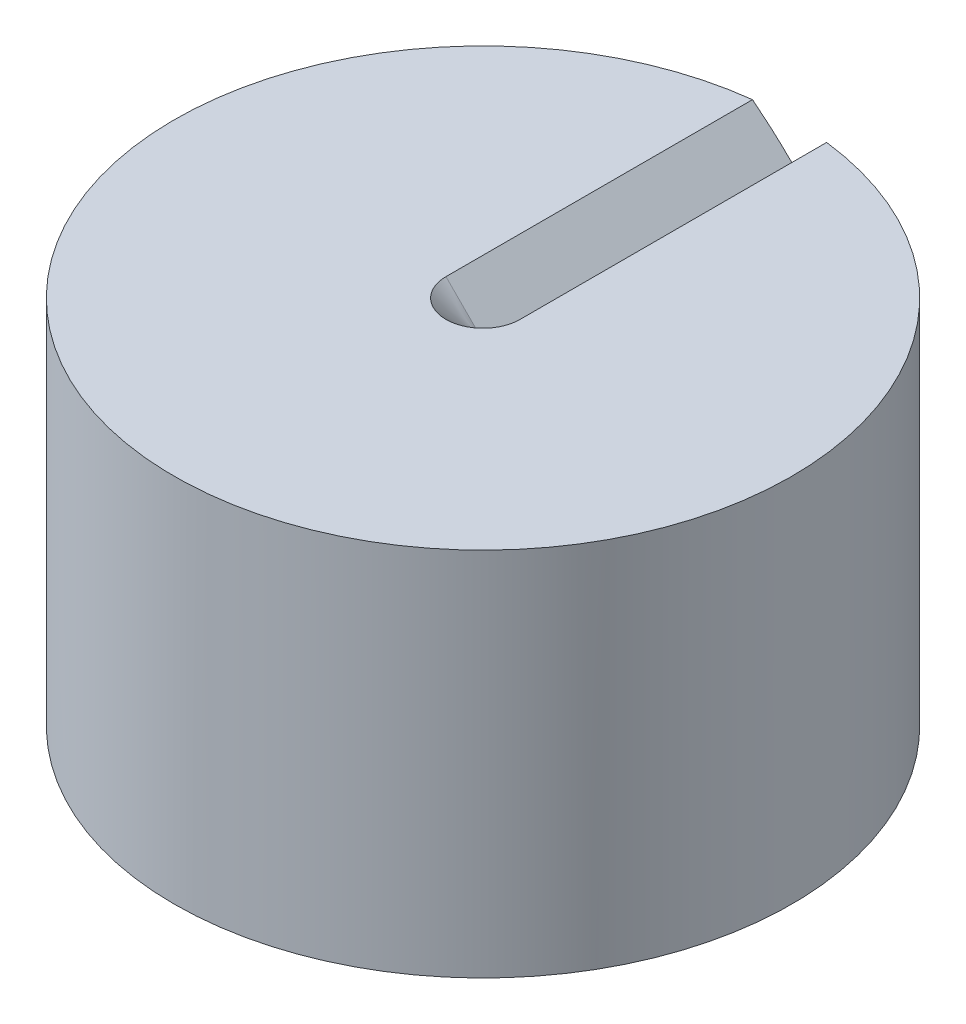
ISO-10303-21;
HEADER;
FILE_DESCRIPTION(('STEP AP214'),'2;1');
FILE_NAME('part.step','',(''),(''),'','','');
FILE_SCHEMA(('AUTOMOTIVE_DESIGN { 1 0 10303 214 1 1 1 1 }'));
ENDSEC;
DATA;
#1=APPLICATION_CONTEXT('core data for automotive mechanical design processes');
#2=APPLICATION_PROTOCOL_DEFINITION('international standard','automotive_design',2000,#1);
#3=PRODUCT_CONTEXT('',#1,'mechanical');
#4=PRODUCT('Part','Part','',(#3));
#5=PRODUCT_RELATED_PRODUCT_CATEGORY('part','',(#4));
#6=PRODUCT_DEFINITION_FORMATION('','',#4);
#7=PRODUCT_DEFINITION_CONTEXT('part definition',#1,'design');
#8=PRODUCT_DEFINITION('design','',#6,#7);
#9=PRODUCT_DEFINITION_SHAPE('','',#8);
#10=(LENGTH_UNIT() NAMED_UNIT(*) SI_UNIT(.MILLI.,.METRE.));
#11=(NAMED_UNIT(*) PLANE_ANGLE_UNIT() SI_UNIT($,.RADIAN.));
#12=(NAMED_UNIT(*) SI_UNIT($,.STERADIAN.) SOLID_ANGLE_UNIT());
#13=UNCERTAINTY_MEASURE_WITH_UNIT(LENGTH_MEASURE(1.E-05),#10,'distance_accuracy_value','');
#14=(GEOMETRIC_REPRESENTATION_CONTEXT(3) GLOBAL_UNCERTAINTY_ASSIGNED_CONTEXT((#13)) GLOBAL_UNIT_ASSIGNED_CONTEXT((#10,
#11,#12)) REPRESENTATION_CONTEXT('',''));
#15=CARTESIAN_POINT('',(0.,0.,0.));
#16=DIRECTION('',(0.,0.,1.));
#17=DIRECTION('',(1.,0.,0.));
#18=AXIS2_PLACEMENT_3D('',#15,#16,#17);
#19=CARTESIAN_POINT('',(0.,67.0173318295596,0.));
#20=DIRECTION('',(0.,-1.,0.));
#21=DIRECTION('',(0.,0.,-1.));
#22=AXIS2_PLACEMENT_3D('',#19,#20,#21);
#23=CYLINDRICAL_SURFACE('',#22,16.51);
#24=CARTESIAN_POINT('',(0.,15.24,0.));
#25=DIRECTION('',(0.,1.,0.));
#26=DIRECTION('',(0.,0.,1.));
#27=AXIS2_PLACEMENT_3D('',#24,#25,#26);
#28=CIRCLE('',#27,16.51);
#29=CARTESIAN_POINT('',(0.,15.24,16.51));
#30=VERTEX_POINT('',#29);
#31=EDGE_CURVE('E80',#30,#30,#28,.F.);
#32=ORIENTED_EDGE('',*,*,#31,.F.);
#33=EDGE_LOOP('',(#32));
#34=FACE_BOUND('',#33,.T.);
#35=CARTESIAN_POINT('',(0.,-2.54,0.));
#36=DIRECTION('',(0.,-1.,0.));
#37=DIRECTION('',(0.,0.,-1.));
#38=AXIS2_PLACEMENT_3D('',#35,#36,#37);
#39=CIRCLE('',#38,16.51);
#40=CARTESIAN_POINT('',(0.,-2.54,-16.51));
#41=VERTEX_POINT('',#40);
#42=EDGE_CURVE('E91',#41,#41,#39,.T.);
#43=ORIENTED_EDGE('',*,*,#42,.T.);
#44=EDGE_LOOP('',(#43));
#45=FACE_BOUND('',#44,.T.);
#46=ADVANCED_FACE('F39',(#34,#45),#23,.F.);
#47=CARTESIAN_POINT('',(0.,67.0173318295596,0.));
#48=DIRECTION('',(0.,-1.,0.));
#49=DIRECTION('',(0.,0.,-1.));
#50=AXIS2_PLACEMENT_3D('',#47,#48,#49);
#51=CYLINDRICAL_SURFACE('',#50,5.0165);
#52=CARTESIAN_POINT('',(0.,13.208,0.));
#53=DIRECTION('',(0.,1.,0.));
#54=DIRECTION('',(0.,0.,1.));
#55=AXIS2_PLACEMENT_3D('',#52,#53,#54);
#56=CIRCLE('',#55,5.0165);
#57=CARTESIAN_POINT('',(0.,13.208,5.0165));
#58=VERTEX_POINT('',#57);
#59=EDGE_CURVE('E102',#58,#58,#56,.F.);
#60=ORIENTED_EDGE('',*,*,#59,.T.);
#61=EDGE_LOOP('',(#60));
#62=FACE_BOUND('',#61,.T.);
#63=CARTESIAN_POINT('',(0.,0.,0.));
#64=DIRECTION('',(0.,-1.,0.));
#65=DIRECTION('',(0.,0.,-1.));
#66=AXIS2_PLACEMENT_3D('',#63,#64,#65);
#67=CIRCLE('',#66,5.0165);
#68=CARTESIAN_POINT('',(0.,0.,-5.0165));
#69=VERTEX_POINT('',#68);
#70=EDGE_CURVE('E110',#69,#69,#67,.T.);
#71=ORIENTED_EDGE('',*,*,#70,.F.);
#72=EDGE_LOOP('',(#71));
#73=FACE_BOUND('',#72,.T.);
#74=ADVANCED_FACE('F135',(#62,#73),#51,.T.);
#75=CARTESIAN_POINT('',(0.,15.24,0.));
#76=DIRECTION('',(0.,1.,0.));
#77=DIRECTION('',(0.,0.,1.));
#78=AXIS2_PLACEMENT_3D('',#75,#76,#77);
#79=PLANE('',#78);
#80=CARTESIAN_POINT('',(0.,15.24,0.));
#81=DIRECTION('',(0.,1.,0.));
#82=DIRECTION('',(0.,0.,1.));
#83=AXIS2_PLACEMENT_3D('',#80,#81,#82);
#84=CIRCLE('',#83,7.0485);
#85=CARTESIAN_POINT('',(0.,15.24,7.0485));
#86=VERTEX_POINT('',#85);
#87=EDGE_CURVE('E99',#86,#86,#84,.T.);
#88=ORIENTED_EDGE('',*,*,#87,.T.);
#89=EDGE_LOOP('',(#88));
#90=FACE_BOUND('',#89,.T.);
#91=ORIENTED_EDGE('',*,*,#31,.T.);
#92=EDGE_LOOP('',(#91));
#93=FACE_BOUND('',#92,.T.);
#94=ADVANCED_FACE('F140',(#90,#93),#79,.F.);
#95=CARTESIAN_POINT('',(0.,6.858,0.));
#96=DIRECTION('',(0.,-1.,0.));
#97=DIRECTION('',(0.,0.,-1.));
#98=AXIS2_PLACEMENT_3D('',#95,#96,#97);
#99=PLANE('',#98);
#100=CARTESIAN_POINT('',(0.,6.858,0.));
#101=DIRECTION('',(0.,-1.,0.));
#102=DIRECTION('',(0.,0.,-1.));
#103=AXIS2_PLACEMENT_3D('',#100,#101,#102);
#104=CIRCLE('',#103,2.9845);
#105=CARTESIAN_POINT('',(0.,6.858,-2.9845));
#106=VERTEX_POINT('',#105);
#107=EDGE_CURVE('E106',#106,#106,#104,.T.);
#108=ORIENTED_EDGE('',*,*,#107,.T.);
#109=EDGE_LOOP('',(#108));
#110=FACE_BOUND('',#109,.T.);
#111=ADVANCED_FACE('F147',(#110),#99,.T.);
#112=CARTESIAN_POINT('',(0.,6.858,0.));
#113=DIRECTION('',(0.,-1.,0.));
#114=DIRECTION('',(0.,0.,-1.));
#115=AXIS2_PLACEMENT_3D('',#112,#113,#114);
#116=CYLINDRICAL_SURFACE('',#115,2.9845);
#117=ORIENTED_EDGE('',*,*,#107,.F.);
#118=EDGE_LOOP('',(#117));
#119=FACE_BOUND('',#118,.T.);
#120=CARTESIAN_POINT('',(0.,0.,0.));
#121=DIRECTION('',(0.,-1.,0.));
#122=DIRECTION('',(0.,0.,-1.));
#123=AXIS2_PLACEMENT_3D('',#120,#121,#122);
#124=CIRCLE('',#123,2.9845);
#125=CARTESIAN_POINT('',(0.,0.,-2.9845));
#126=VERTEX_POINT('',#125);
#127=EDGE_CURVE('E107',#126,#126,#124,.T.);
#128=ORIENTED_EDGE('',*,*,#127,.T.);
#129=EDGE_LOOP('',(#128));
#130=FACE_BOUND('',#129,.T.);
#131=ADVANCED_FACE('F151',(#119,#130),#116,.F.);
#132=CARTESIAN_POINT('',(0.,0.,0.));
#133=DIRECTION('',(0.,1.,0.));
#134=DIRECTION('',(0.,0.,1.));
#135=AXIS2_PLACEMENT_3D('',#132,#133,#134);
#136=PLANE('',#135);
#137=ORIENTED_EDGE('',*,*,#127,.F.);
#138=EDGE_LOOP('',(#137));
#139=FACE_BOUND('',#138,.T.);
#140=ORIENTED_EDGE('',*,*,#70,.T.);
#141=EDGE_LOOP('',(#140));
#142=FACE_BOUND('',#141,.T.);
#143=ADVANCED_FACE('F130',(#139,#142),#136,.F.);
#144=CARTESIAN_POINT('',(0.,13.208,0.));
#145=DIRECTION('',(0.,1.,0.));
#146=DIRECTION('',(0.,0.,1.));
#147=AXIS2_PLACEMENT_3D('',#144,#145,#146);
#148=TOROIDAL_SURFACE('',#147,7.0485,2.032);
#149=ORIENTED_EDGE('',*,*,#87,.F.);
#150=EDGE_LOOP('',(#149));
#151=FACE_BOUND('',#150,.T.);
#152=ORIENTED_EDGE('',*,*,#59,.F.);
#153=EDGE_LOOP('',(#152));
#154=FACE_BOUND('',#153,.T.);
#155=ADVANCED_FACE('F123',(#151,#154),#148,.F.);
#156=CARTESIAN_POINT('',(0.,-2.54,0.));
#157=DIRECTION('',(0.,-1.,0.));
#158=DIRECTION('',(0.,0.,-1.));
#159=AXIS2_PLACEMENT_3D('',#156,#157,#158);
#160=PLANE('',#159);
#161=CARTESIAN_POINT('',(0.,-2.54,0.));
#162=DIRECTION('',(0.,-1.,0.));
#163=DIRECTION('',(0.,0.,-1.));
#164=AXIS2_PLACEMENT_3D('',#161,#162,#163);
#165=CIRCLE('',#164,19.05);
#166=CARTESIAN_POINT('',(0.,-2.54,-19.05));
#167=VERTEX_POINT('',#166);
#168=EDGE_CURVE('E88',#167,#167,#165,.T.);
#169=ORIENTED_EDGE('',*,*,#168,.T.);
#170=EDGE_LOOP('',(#169));
#171=FACE_BOUND('',#170,.T.);
#172=ORIENTED_EDGE('',*,*,#42,.F.);
#173=EDGE_LOOP('',(#172));
#174=FACE_BOUND('',#173,.T.);
#175=ADVANCED_FACE('F121',(#171,#174),#160,.T.);
#176=CARTESIAN_POINT('',(0.,20.574,0.));
#177=DIRECTION('',(0.,1.,0.));
#178=DIRECTION('',(0.,0.,1.));
#179=AXIS2_PLACEMENT_3D('',#176,#177,#178);
#180=CONICAL_SURFACE('',#179,2.54000000000004,0.785398163397454);
#181=DIRECTION('',(0.707106781186551,-0.707106781186544,0.));
#182=VECTOR('',#181,1.);
#183=CARTESIAN_POINT('',(-2.54,20.574,0.));
#184=LINE('',#183,#182);
#185=CARTESIAN_POINT('',(-2.28599999999998,20.32,0.));
#186=VERTEX_POINT('',#185);
#187=CARTESIAN_POINT('',(0.,18.034,0.));
#188=VERTEX_POINT('',#187);
#189=EDGE_CURVE('E43',#186,#188,#184,.T.);
#190=ORIENTED_EDGE('',*,*,#189,.F.);
#191=CARTESIAN_POINT('',(0.,20.32,0.));
#192=DIRECTION('',(0.,1.,0.));
#193=DIRECTION('',(0.,0.,1.));
#194=AXIS2_PLACEMENT_3D('',#191,#192,#193);
#195=CIRCLE('',#194,2.28600000000002);
#196=CARTESIAN_POINT('',(2.28599999999998,20.32,0.));
#197=VERTEX_POINT('',#196);
#198=EDGE_CURVE('E83',#197,#186,#195,.F.);
#199=ORIENTED_EDGE('',*,*,#198,.F.);
#200=DIRECTION('',(0.707106781186551,0.707106781186544,0.));
#201=VECTOR('',#200,1.);
#202=CARTESIAN_POINT('',(0.,18.034,0.));
#203=LINE('',#202,#201);
#204=EDGE_CURVE('E81',#188,#197,#203,.T.);
#205=ORIENTED_EDGE('',*,*,#204,.F.);
#206=EDGE_LOOP('',(#190,#199,#205));
#207=FACE_BOUND('',#206,.T.);
#208=ADVANCED_FACE('F41',(#207),#180,.F.);
#209=CARTESIAN_POINT('',(0.,18.034,0.));
#210=DIRECTION('',(0.707106781186544,-0.707106781186551,0.));
#211=DIRECTION('',(0.,0.,-1.));
#212=AXIS2_PLACEMENT_3D('',#209,#210,#211);
#213=PLANE('',#212);
#214=DIRECTION('',(0.,0.,1.));
#215=VECTOR('',#214,1.);
#216=CARTESIAN_POINT('',(0.,18.034,0.));
#217=LINE('',#216,#215);
#218=CARTESIAN_POINT('',(0.,18.034,-19.05));
#219=VERTEX_POINT('',#218);
#220=EDGE_CURVE('E76',#219,#188,#217,.T.);
#221=ORIENTED_EDGE('',*,*,#220,.T.);
#222=ORIENTED_EDGE('',*,*,#204,.T.);
#223=DIRECTION('',(0.,0.,1.));
#224=VECTOR('',#223,1.);
#225=CARTESIAN_POINT('',(2.28599999999998,20.32,0.));
#226=LINE('',#225,#224);
#227=CARTESIAN_POINT('',(2.28599999999998,20.32,-18.9123426364901));
#228=VERTEX_POINT('',#227);
#229=EDGE_CURVE('E96',#228,#197,#226,.T.);
#230=ORIENTED_EDGE('',*,*,#229,.F.);
#231=CARTESIAN_POINT('',(0.,18.034,0.));
#232=DIRECTION('',(0.707106781186544,-0.707106781186551,0.));
#233=DIRECTION('',(-0.707106781186551,-0.707106781186544,0.));
#234=AXIS2_PLACEMENT_3D('',#231,#232,#233);
#235=ELLIPSE('',#234,26.9407683632073,19.05);
#236=EDGE_CURVE('E87',#219,#228,#235,.T.);
#237=ORIENTED_EDGE('',*,*,#236,.F.);
#238=EDGE_LOOP('',(#221,#222,#230,#237));
#239=FACE_BOUND('',#238,.T.);
#240=ADVANCED_FACE('F86',(#239),#213,.F.);
#241=CARTESIAN_POINT('',(0.,18.034,0.));
#242=DIRECTION('',(-0.707106781186544,-0.707106781186551,0.));
#243=DIRECTION('',(0.,0.,1.));
#244=AXIS2_PLACEMENT_3D('',#241,#242,#243);
#245=PLANE('',#244);
#246=DIRECTION('',(0.,0.,-1.));
#247=VECTOR('',#246,1.);
#248=CARTESIAN_POINT('',(-2.28599999999998,20.32,0.));
#249=LINE('',#248,#247);
#250=CARTESIAN_POINT('',(-2.28599999999998,20.32,-18.9123426364901));
#251=VERTEX_POINT('',#250);
#252=EDGE_CURVE('E49',#186,#251,#249,.T.);
#253=ORIENTED_EDGE('',*,*,#252,.F.);
#254=ORIENTED_EDGE('',*,*,#189,.T.);
#255=ORIENTED_EDGE('',*,*,#220,.F.);
#256=CARTESIAN_POINT('',(0.,18.034,0.));
#257=DIRECTION('',(-0.707106781186544,-0.707106781186551,0.));
#258=DIRECTION('',(0.707106781186551,-0.707106781186544,0.));
#259=AXIS2_PLACEMENT_3D('',#256,#257,#258);
#260=ELLIPSE('',#259,26.9407683632073,19.05);
#261=EDGE_CURVE('E12',#251,#219,#260,.T.);
#262=ORIENTED_EDGE('',*,*,#261,.F.);
#263=EDGE_LOOP('',(#253,#254,#255,#262));
#264=FACE_BOUND('',#263,.T.);
#265=ADVANCED_FACE('F74',(#264),#245,.F.);
#266=CARTESIAN_POINT('',(0.,20.32,0.));
#267=DIRECTION('',(0.,1.,0.));
#268=DIRECTION('',(0.,0.,1.));
#269=AXIS2_PLACEMENT_3D('',#266,#267,#268);
#270=PLANE('',#269);
#271=ORIENTED_EDGE('',*,*,#198,.T.);
#272=ORIENTED_EDGE('',*,*,#252,.T.);
#273=CARTESIAN_POINT('',(0.,20.32,0.));
#274=DIRECTION('',(0.,1.,0.));
#275=DIRECTION('',(0.,0.,1.));
#276=AXIS2_PLACEMENT_3D('',#273,#274,#275);
#277=CIRCLE('',#276,19.05);
#278=EDGE_CURVE('E56',#251,#228,#277,.T.);
#279=ORIENTED_EDGE('',*,*,#278,.T.);
#280=ORIENTED_EDGE('',*,*,#229,.T.);
#281=EDGE_LOOP('',(#271,#272,#279,#280));
#282=FACE_BOUND('',#281,.T.);
#283=ADVANCED_FACE('F156',(#282),#270,.T.);
#284=CARTESIAN_POINT('',(0.,20.32,0.));
#285=DIRECTION('',(0.,-1.,0.));
#286=DIRECTION('',(0.,0.,-1.));
#287=AXIS2_PLACEMENT_3D('',#284,#285,#286);
#288=CYLINDRICAL_SURFACE('',#287,19.05);
#289=ORIENTED_EDGE('',*,*,#278,.F.);
#290=ORIENTED_EDGE('',*,*,#261,.T.);
#291=ORIENTED_EDGE('',*,*,#236,.T.);
#292=EDGE_LOOP('',(#289,#290,#291));
#293=FACE_BOUND('',#292,.T.);
#294=ORIENTED_EDGE('',*,*,#168,.F.);
#295=EDGE_LOOP('',(#294));
#296=FACE_BOUND('',#295,.T.);
#297=ADVANCED_FACE('F159',(#293,#296),#288,.T.);
#298=CLOSED_SHELL('',(#46,#74,#94,#111,#131,#143,#155,#175,#208,#240,#265,#283,#297));
#299=MANIFOLD_SOLID_BREP('B2',#298);
#300=ADVANCED_BREP_SHAPE_REPRESENTATION('',(#18,#299),#14);
#301=SHAPE_DEFINITION_REPRESENTATION(#9,#300);
ENDSEC;
END-ISO-10303-21;
